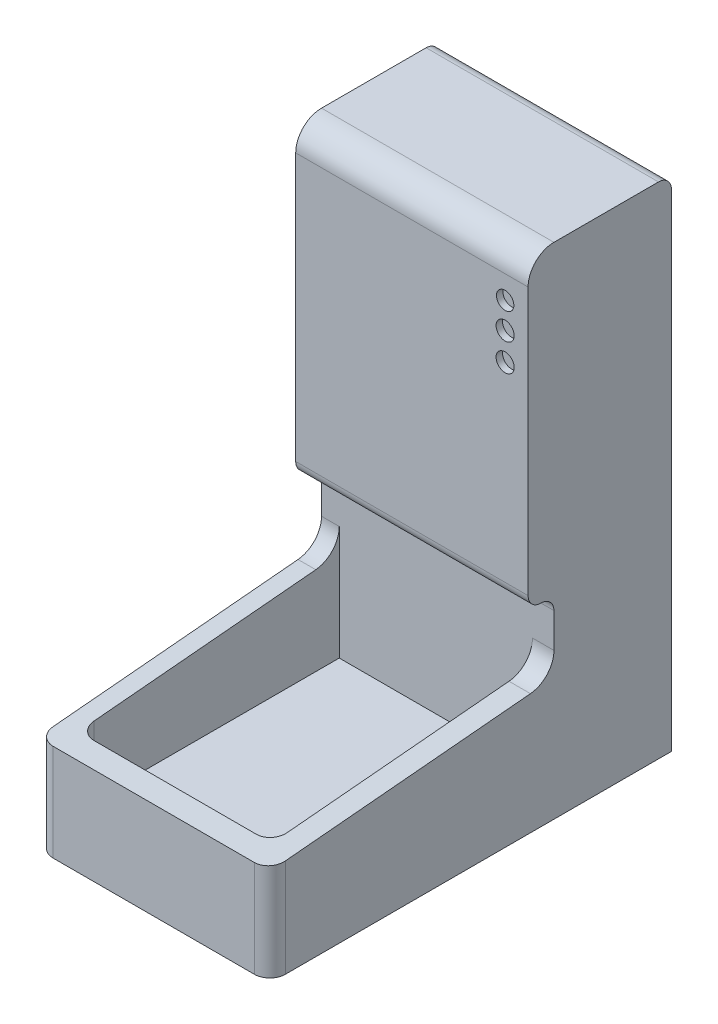
ISO-10303-21;
HEADER;
FILE_DESCRIPTION(('STEP AP214'),'2;1');
FILE_NAME('part.step','',(''),(''),'','','');
FILE_SCHEMA(('AUTOMOTIVE_DESIGN { 1 0 10303 214 1 1 1 1 }'));
ENDSEC;
DATA;
#1=APPLICATION_CONTEXT('core data for automotive mechanical design processes');
#2=APPLICATION_PROTOCOL_DEFINITION('international standard','automotive_design',2000,#1);
#3=PRODUCT_CONTEXT('',#1,'mechanical');
#4=PRODUCT('Part','Part','',(#3));
#5=PRODUCT_RELATED_PRODUCT_CATEGORY('part','',(#4));
#6=PRODUCT_DEFINITION_FORMATION('','',#4);
#7=PRODUCT_DEFINITION_CONTEXT('part definition',#1,'design');
#8=PRODUCT_DEFINITION('design','',#6,#7);
#9=PRODUCT_DEFINITION_SHAPE('','',#8);
#10=(LENGTH_UNIT() NAMED_UNIT(*) SI_UNIT(.MILLI.,.METRE.));
#11=(NAMED_UNIT(*) PLANE_ANGLE_UNIT() SI_UNIT($,.RADIAN.));
#12=(NAMED_UNIT(*) SI_UNIT($,.STERADIAN.) SOLID_ANGLE_UNIT());
#13=UNCERTAINTY_MEASURE_WITH_UNIT(LENGTH_MEASURE(1.E-05),#10,'distance_accuracy_value','');
#14=(GEOMETRIC_REPRESENTATION_CONTEXT(3) GLOBAL_UNCERTAINTY_ASSIGNED_CONTEXT((#13)) GLOBAL_UNIT_ASSIGNED_CONTEXT((#10,
#11,#12)) REPRESENTATION_CONTEXT('',''));
#15=CARTESIAN_POINT('',(0.,0.,0.));
#16=DIRECTION('',(0.,0.,1.));
#17=DIRECTION('',(1.,0.,0.));
#18=AXIS2_PLACEMENT_3D('',#15,#16,#17);
#19=CARTESIAN_POINT('',(2286.,-1104.9,901.7));
#20=DIRECTION('',(0.,0.,-1.));
#21=DIRECTION('',(0.,1.,0.));
#22=AXIS2_PLACEMENT_3D('',#19,#20,#21);
#23=PLANE('',#22);
#24=DIRECTION('',(0.,-1.,0.));
#25=VECTOR('',#24,1.);
#26=CARTESIAN_POINT('',(1863.97057831795,-2374.9,901.7));
#27=LINE('',#26,#25);
#28=CARTESIAN_POINT('',(1863.97057831795,-2037.98696393353,901.7));
#29=VERTEX_POINT('',#28);
#30=CARTESIAN_POINT('',(1863.97057831795,-4279.9,901.7));
#31=VERTEX_POINT('',#30);
#32=EDGE_CURVE('E174',#29,#31,#27,.T.);
#33=ORIENTED_EDGE('',*,*,#32,.F.);
#34=DIRECTION('',(1.,0.,0.));
#35=VECTOR('',#34,1.);
#36=CARTESIAN_POINT('',(2286.,-2037.98696393353,901.7));
#37=LINE('',#36,#35);
#38=CARTESIAN_POINT('',(2286.,-2037.98696393353,901.7));
#39=VERTEX_POINT('',#38);
#40=EDGE_CURVE('E346',#29,#39,#37,.T.);
#41=ORIENTED_EDGE('',*,*,#40,.T.);
#42=DIRECTION('',(0.,-1.,0.));
#43=VECTOR('',#42,1.);
#44=CARTESIAN_POINT('',(2286.,-1104.9,901.7));
#45=LINE('',#44,#43);
#46=CARTESIAN_POINT('',(2286.,-1358.9,901.7));
#47=VERTEX_POINT('',#46);
#48=EDGE_CURVE('E232',#47,#39,#45,.T.);
#49=ORIENTED_EDGE('',*,*,#48,.F.);
#50=DIRECTION('',(-1.,0.,0.));
#51=VECTOR('',#50,1.);
#52=CARTESIAN_POINT('',(-2286.,-1358.9,901.7));
#53=LINE('',#52,#51);
#54=CARTESIAN_POINT('',(-2286.,-1358.9,901.7));
#55=VERTEX_POINT('',#54);
#56=EDGE_CURVE('E292',#47,#55,#53,.T.);
#57=ORIENTED_EDGE('',*,*,#56,.T.);
#58=DIRECTION('',(0.,-1.,0.));
#59=VECTOR('',#58,1.);
#60=CARTESIAN_POINT('',(-2286.,-1104.9,901.7));
#61=LINE('',#60,#59);
#62=CARTESIAN_POINT('',(-2286.,-2037.98696393353,901.7));
#63=VERTEX_POINT('',#62);
#64=EDGE_CURVE('E246',#55,#63,#61,.T.);
#65=ORIENTED_EDGE('',*,*,#64,.T.);
#66=DIRECTION('',(1.,0.,0.));
#67=VECTOR('',#66,1.);
#68=CARTESIAN_POINT('',(2286.,-2037.98696393353,901.7));
#69=LINE('',#68,#67);
#70=CARTESIAN_POINT('',(-1937.25143072823,-2037.98696393353,901.7));
#71=VERTEX_POINT('',#70);
#72=EDGE_CURVE('E344',#63,#71,#69,.T.);
#73=ORIENTED_EDGE('',*,*,#72,.T.);
#74=DIRECTION('',(0.,-1.,0.));
#75=VECTOR('',#74,1.);
#76=CARTESIAN_POINT('',(-1937.25143072823,-2374.9,901.7));
#77=LINE('',#76,#75);
#78=CARTESIAN_POINT('',(-1937.25143072823,-4279.9,901.7));
#79=VERTEX_POINT('',#78);
#80=EDGE_CURVE('E187',#71,#79,#77,.T.);
#81=ORIENTED_EDGE('',*,*,#80,.T.);
#82=DIRECTION('',(1.,0.,0.));
#83=VECTOR('',#82,1.);
#84=CARTESIAN_POINT('',(-1937.25143072823,-4279.9,901.7));
#85=LINE('',#84,#83);
#86=EDGE_CURVE('E191',#79,#31,#85,.T.);
#87=ORIENTED_EDGE('',*,*,#86,.T.);
#88=EDGE_LOOP('',(#33,#41,#49,#57,#65,#73,#81,#87));
#89=FACE_BOUND('',#88,.T.);
#90=ADVANCED_FACE('F33',(#89),#23,.F.);
#91=CARTESIAN_POINT('',(-1937.25143072823,-2374.9,6031.00359694514));
#92=DIRECTION('',(-1.,0.,0.));
#93=DIRECTION('',(0.,0.,1.));
#94=AXIS2_PLACEMENT_3D('',#91,#92,#93);
#95=PLANE('',#94);
#96=ORIENTED_EDGE('',*,*,#80,.F.);
#97=CARTESIAN_POINT('',(-1937.25143072823,-2037.98696393353,1409.7));
#98=DIRECTION('',(-1.,0.,0.));
#99=DIRECTION('',(0.,0.,1.));
#100=AXIS2_PLACEMENT_3D('',#97,#98,#99);
#101=CIRCLE('',#100,508.);
#102=CARTESIAN_POINT('',(-1937.25143072823,-2543.90071281913,1363.7078410104));
#103=VERTEX_POINT('',#102);
#104=EDGE_CURVE('E41',#71,#103,#101,.T.);
#105=ORIENTED_EDGE('',*,*,#104,.T.);
#106=DIRECTION('',(0.,-0.0905357460425185,0.995893206467704));
#107=VECTOR('',#106,1.);
#108=CARTESIAN_POINT('',(-1937.25143072823,-3009.9,6489.7));
#109=LINE('',#108,#107);
#110=CARTESIAN_POINT('',(-1937.25143072823,-2940.49123608592,5726.20359694514));
#111=VERTEX_POINT('',#110);
#112=EDGE_CURVE('E304',#103,#111,#109,.T.);
#113=ORIENTED_EDGE('',*,*,#112,.T.);
#114=DIRECTION('',(0.,-1.,0.));
#115=VECTOR('',#114,1.);
#116=CARTESIAN_POINT('',(-1937.25143072823,-4279.9,5726.20359694514));
#117=LINE('',#116,#115);
#118=CARTESIAN_POINT('',(-1937.25143072823,-4279.9,5726.20359694514));
#119=VERTEX_POINT('',#118);
#120=EDGE_CURVE('E316',#111,#119,#117,.T.);
#121=ORIENTED_EDGE('',*,*,#120,.T.);
#122=DIRECTION('',(0.,0.,-1.));
#123=VECTOR('',#122,1.);
#124=CARTESIAN_POINT('',(-1937.25143072823,-4279.9,6031.00359694514));
#125=LINE('',#124,#123);
#126=EDGE_CURVE('E195',#119,#79,#125,.T.);
#127=ORIENTED_EDGE('',*,*,#126,.T.);
#128=EDGE_LOOP('',(#96,#105,#113,#121,#127));
#129=FACE_BOUND('',#128,.T.);
#130=ADVANCED_FACE('F428',(#129),#95,.F.);
#131=CARTESIAN_POINT('',(-1937.25143072823,-2374.9,6031.00359694514));
#132=DIRECTION('',(0.,0.,1.));
#133=DIRECTION('',(0.,-1.,0.));
#134=AXIS2_PLACEMENT_3D('',#131,#132,#133);
#135=PLANE('',#134);
#136=DIRECTION('',(1.,0.,0.));
#137=VECTOR('',#136,1.);
#138=CARTESIAN_POINT('',(-2286.,-2968.20032699501,6031.00359694514));
#139=LINE('',#138,#137);
#140=CARTESIAN_POINT('',(-1632.45143072823,-2968.20032699501,6031.00359694514));
#141=VERTEX_POINT('',#140);
#142=CARTESIAN_POINT('',(1559.17057831795,-2968.20032699501,6031.00359694514));
#143=VERTEX_POINT('',#142);
#144=EDGE_CURVE('E301',#141,#143,#139,.T.);
#145=ORIENTED_EDGE('',*,*,#144,.T.);
#146=DIRECTION('',(0.,-1.,0.));
#147=VECTOR('',#146,1.);
#148=CARTESIAN_POINT('',(1559.17057831795,-4279.9,6031.00359694514));
#149=LINE('',#148,#147);
#150=CARTESIAN_POINT('',(1559.17057831795,-4279.9,6031.00359694514));
#151=VERTEX_POINT('',#150);
#152=EDGE_CURVE('E308',#143,#151,#149,.T.);
#153=ORIENTED_EDGE('',*,*,#152,.T.);
#154=DIRECTION('',(-1.,0.,0.));
#155=VECTOR('',#154,1.);
#156=CARTESIAN_POINT('',(-1937.25143072823,-4279.9,6031.00359694514));
#157=LINE('',#156,#155);
#158=CARTESIAN_POINT('',(-1632.45143072823,-4279.9,6031.00359694514));
#159=VERTEX_POINT('',#158);
#160=EDGE_CURVE('E200',#151,#159,#157,.T.);
#161=ORIENTED_EDGE('',*,*,#160,.T.);
#162=DIRECTION('',(0.,-1.,0.));
#163=VECTOR('',#162,1.);
#164=CARTESIAN_POINT('',(-1632.45143072823,-2968.20032699501,6031.00359694514));
#165=LINE('',#164,#163);
#166=EDGE_CURVE('E306',#159,#141,#165,.F.);
#167=ORIENTED_EDGE('',*,*,#166,.T.);
#168=EDGE_LOOP('',(#145,#153,#161,#167));
#169=FACE_BOUND('',#168,.T.);
#170=ADVANCED_FACE('F433',(#169),#135,.F.);
#171=CARTESIAN_POINT('',(1863.97057831795,-2374.9,6031.00359694514));
#172=DIRECTION('',(1.,0.,0.));
#173=DIRECTION('',(0.,0.,-1.));
#174=AXIS2_PLACEMENT_3D('',#171,#172,#173);
#175=PLANE('',#174);
#176=DIRECTION('',(0.,0.,1.));
#177=VECTOR('',#176,1.);
#178=CARTESIAN_POINT('',(1863.97057831795,-4279.9,6031.00359694514));
#179=LINE('',#178,#177);
#180=CARTESIAN_POINT('',(1863.97057831795,-4279.9,5726.20359694514));
#181=VERTEX_POINT('',#180);
#182=EDGE_CURVE('E178',#31,#181,#179,.T.);
#183=ORIENTED_EDGE('',*,*,#182,.T.);
#184=DIRECTION('',(0.,-1.,0.));
#185=VECTOR('',#184,1.);
#186=CARTESIAN_POINT('',(1863.97057831795,-2968.20032699501,5726.20359694514));
#187=LINE('',#186,#185);
#188=CARTESIAN_POINT('',(1863.97057831795,-2940.49123608592,5726.20359694514));
#189=VERTEX_POINT('',#188);
#190=EDGE_CURVE('E314',#181,#189,#187,.F.);
#191=ORIENTED_EDGE('',*,*,#190,.T.);
#192=DIRECTION('',(0.,0.0905357460425185,-0.995893206467704));
#193=VECTOR('',#192,1.);
#194=CARTESIAN_POINT('',(1863.97057831795,-3009.9,6489.7));
#195=LINE('',#194,#193);
#196=CARTESIAN_POINT('',(1863.97057831795,-2543.90071281913,1363.7078410104));
#197=VERTEX_POINT('',#196);
#198=EDGE_CURVE('E299',#189,#197,#195,.T.);
#199=ORIENTED_EDGE('',*,*,#198,.T.);
#200=CARTESIAN_POINT('',(1863.97057831795,-2037.98696393353,1409.7));
#201=DIRECTION('',(1.,0.,0.));
#202=DIRECTION('',(0.,0.,-1.));
#203=AXIS2_PLACEMENT_3D('',#200,#201,#202);
#204=CIRCLE('',#203,508.);
#205=EDGE_CURVE('E182',#197,#29,#204,.T.);
#206=ORIENTED_EDGE('',*,*,#205,.T.);
#207=ORIENTED_EDGE('',*,*,#32,.T.);
#208=EDGE_LOOP('',(#183,#191,#199,#206,#207));
#209=FACE_BOUND('',#208,.T.);
#210=ADVANCED_FACE('F176',(#209),#175,.F.);
#211=CARTESIAN_POINT('',(2286.,-1104.9,1409.7));
#212=DIRECTION('',(0.,0.,-1.));
#213=DIRECTION('',(-1.,0.,0.));
#214=AXIS2_PLACEMENT_3D('',#211,#212,#213);
#215=PLANE('',#214);
#216=CARTESIAN_POINT('',(1834.34503113877,3953.74526364137,1409.7));
#217=DIRECTION('',(0.,0.,1.));
#218=DIRECTION('',(1.,0.,0.));
#219=AXIS2_PLACEMENT_3D('',#216,#217,#218);
#220=CIRCLE('',#219,171.4501557811);
#221=CARTESIAN_POINT('',(2005.79518691987,3953.74526364137,1409.7));
#222=VERTEX_POINT('',#221);
#223=EDGE_CURVE('E215',#222,#222,#220,.T.);
#224=ORIENTED_EDGE('',*,*,#223,.F.);
#225=EDGE_LOOP('',(#224));
#226=FACE_BOUND('',#225,.T.);
#227=CARTESIAN_POINT('',(1834.34503113877,3439.39479629807,1409.7));
#228=DIRECTION('',(0.,0.,1.));
#229=DIRECTION('',(1.,0.,0.));
#230=AXIS2_PLACEMENT_3D('',#227,#228,#229);
#231=CIRCLE('',#230,178.04439254191);
#232=CARTESIAN_POINT('',(2012.38942368068,3439.39479629807,1409.7));
#233=VERTEX_POINT('',#232);
#234=EDGE_CURVE('E221',#233,#233,#231,.T.);
#235=ORIENTED_EDGE('',*,*,#234,.F.);
#236=EDGE_LOOP('',(#235));
#237=FACE_BOUND('',#236,.T.);
#238=CARTESIAN_POINT('',(1834.34503113877,2898.66738191153,1409.7));
#239=DIRECTION('',(0.,0.,1.));
#240=DIRECTION('',(1.,0.,0.));
#241=AXIS2_PLACEMENT_3D('',#238,#239,#240);
#242=CIRCLE('',#241,178.044392541911);
#243=CARTESIAN_POINT('',(2012.38942368069,2898.66738191153,1409.7));
#244=VERTEX_POINT('',#243);
#245=EDGE_CURVE('E209',#244,#244,#242,.T.);
#246=ORIENTED_EDGE('',*,*,#245,.F.);
#247=EDGE_LOOP('',(#246));
#248=FACE_BOUND('',#247,.T.);
#249=DIRECTION('',(0.,-1.,0.));
#250=VECTOR('',#249,1.);
#251=CARTESIAN_POINT('',(-2286.,-1104.9,1409.7));
#252=LINE('',#251,#250);
#253=CARTESIAN_POINT('',(-2286.,4406.9,1409.7));
#254=VERTEX_POINT('',#253);
#255=CARTESIAN_POINT('',(-2286.,-850.900000000002,1409.7));
#256=VERTEX_POINT('',#255);
#257=EDGE_CURVE('E214',#254,#256,#252,.T.);
#258=ORIENTED_EDGE('',*,*,#257,.T.);
#259=DIRECTION('',(-1.,0.,0.));
#260=VECTOR('',#259,1.);
#261=CARTESIAN_POINT('',(2286.,-850.900000000002,1409.7));
#262=LINE('',#261,#260);
#263=CARTESIAN_POINT('',(2286.,-850.900000000002,1409.7));
#264=VERTEX_POINT('',#263);
#265=EDGE_CURVE('E290',#256,#264,#262,.F.);
#266=ORIENTED_EDGE('',*,*,#265,.T.);
#267=DIRECTION('',(0.,-1.,0.));
#268=VECTOR('',#267,1.);
#269=CARTESIAN_POINT('',(2286.,-1104.9,1409.7));
#270=LINE('',#269,#268);
#271=CARTESIAN_POINT('',(2286.,4406.9,1409.7));
#272=VERTEX_POINT('',#271);
#273=EDGE_CURVE('E229',#272,#264,#270,.T.);
#274=ORIENTED_EDGE('',*,*,#273,.F.);
#275=DIRECTION('',(-1.,0.,0.));
#276=VECTOR('',#275,1.);
#277=CARTESIAN_POINT('',(2286.,4406.9,1409.7));
#278=LINE('',#277,#276);
#279=EDGE_CURVE('E263',#272,#254,#278,.T.);
#280=ORIENTED_EDGE('',*,*,#279,.T.);
#281=EDGE_LOOP('',(#258,#266,#274,#280));
#282=FACE_BOUND('',#281,.T.);
#283=ADVANCED_FACE('F382',(#226,#237,#248,#282),#215,.F.);
#284=CARTESIAN_POINT('',(2286.,-4914.9,6489.7));
#285=DIRECTION('',(0.,0.,-1.));
#286=DIRECTION('',(-1.,0.,0.));
#287=AXIS2_PLACEMENT_3D('',#284,#285,#286);
#288=PLANE('',#287);
#289=DIRECTION('',(-1.,0.,0.));
#290=VECTOR('',#289,1.);
#291=CARTESIAN_POINT('',(2286.,-4914.9,6489.7));
#292=LINE('',#291,#290);
#293=CARTESIAN_POINT('',(1981.2,-4914.9,6489.7));
#294=VERTEX_POINT('',#293);
#295=CARTESIAN_POINT('',(-1981.2,-4914.9,6489.7));
#296=VERTEX_POINT('',#295);
#297=EDGE_CURVE('E257',#294,#296,#292,.T.);
#298=ORIENTED_EDGE('',*,*,#297,.F.);
#299=DIRECTION('',(0.,-1.,0.));
#300=VECTOR('',#299,1.);
#301=CARTESIAN_POINT('',(1981.2,-3009.9,6489.7));
#302=LINE('',#301,#300);
#303=CARTESIAN_POINT('',(1981.2,-3009.9,6489.7));
#304=VERTEX_POINT('',#303);
#305=EDGE_CURVE('E329',#294,#304,#302,.F.);
#306=ORIENTED_EDGE('',*,*,#305,.T.);
#307=DIRECTION('',(-1.,0.,0.));
#308=VECTOR('',#307,1.);
#309=CARTESIAN_POINT('',(2286.,-3009.9,6489.7));
#310=LINE('',#309,#308);
#311=CARTESIAN_POINT('',(-1981.2,-3009.9,6489.7));
#312=VERTEX_POINT('',#311);
#313=EDGE_CURVE('E260',#304,#312,#310,.T.);
#314=ORIENTED_EDGE('',*,*,#313,.T.);
#315=DIRECTION('',(0.,-1.,0.));
#316=VECTOR('',#315,1.);
#317=CARTESIAN_POINT('',(-1981.2,-4914.9,6489.7));
#318=LINE('',#317,#316);
#319=EDGE_CURVE('E326',#312,#296,#318,.T.);
#320=ORIENTED_EDGE('',*,*,#319,.T.);
#321=EDGE_LOOP('',(#298,#306,#314,#320));
#322=FACE_BOUND('',#321,.T.);
#323=ADVANCED_FACE('F412',(#322),#288,.F.);
#324=CARTESIAN_POINT('',(2286.,-4914.9,-1409.7));
#325=DIRECTION('',(0.,1.,0.));
#326=DIRECTION('',(0.,0.,1.));
#327=AXIS2_PLACEMENT_3D('',#324,#325,#326);
#328=PLANE('',#327);
#329=DIRECTION('',(0.,0.,-1.));
#330=VECTOR('',#329,1.);
#331=CARTESIAN_POINT('',(2286.,-4914.9,1409.7));
#332=LINE('',#331,#330);
#333=CARTESIAN_POINT('',(2286.,-4914.9,6184.9));
#334=VERTEX_POINT('',#333);
#335=CARTESIAN_POINT('',(2286.,-4914.9,-1409.7));
#336=VERTEX_POINT('',#335);
#337=EDGE_CURVE('E236',#334,#336,#332,.T.);
#338=ORIENTED_EDGE('',*,*,#337,.F.);
#339=CARTESIAN_POINT('',(1981.2,-4914.9,6184.9));
#340=DIRECTION('',(0.,1.,0.));
#341=DIRECTION('',(0.,0.,1.));
#342=AXIS2_PLACEMENT_3D('',#339,#340,#341);
#343=CIRCLE('',#342,304.8);
#344=EDGE_CURVE('E324',#334,#294,#343,.F.);
#345=ORIENTED_EDGE('',*,*,#344,.T.);
#346=ORIENTED_EDGE('',*,*,#297,.T.);
#347=CARTESIAN_POINT('',(-1981.2,-4914.9,6184.9));
#348=DIRECTION('',(0.,1.,0.));
#349=DIRECTION('',(0.,0.,1.));
#350=AXIS2_PLACEMENT_3D('',#347,#348,#349);
#351=CIRCLE('',#350,304.8);
#352=CARTESIAN_POINT('',(-2286.,-4914.9,6184.9));
#353=VERTEX_POINT('',#352);
#354=EDGE_CURVE('E322',#296,#353,#351,.F.);
#355=ORIENTED_EDGE('',*,*,#354,.T.);
#356=DIRECTION('',(0.,0.,-1.));
#357=VECTOR('',#356,1.);
#358=CARTESIAN_POINT('',(-2286.,-4914.9,-1409.7));
#359=LINE('',#358,#357);
#360=CARTESIAN_POINT('',(-2286.,-4914.9,-1409.7));
#361=VERTEX_POINT('',#360);
#362=EDGE_CURVE('E249',#353,#361,#359,.T.);
#363=ORIENTED_EDGE('',*,*,#362,.T.);
#364=DIRECTION('',(-1.,0.,0.));
#365=VECTOR('',#364,1.);
#366=CARTESIAN_POINT('',(2286.,-4914.9,-1409.7));
#367=LINE('',#366,#365);
#368=EDGE_CURVE('E243',#336,#361,#367,.T.);
#369=ORIENTED_EDGE('',*,*,#368,.F.);
#370=EDGE_LOOP('',(#338,#345,#346,#355,#363,#369));
#371=FACE_BOUND('',#370,.T.);
#372=ADVANCED_FACE('F404',(#371),#328,.F.);
#373=CARTESIAN_POINT('',(2286.,-4914.9,-1409.7));
#374=DIRECTION('',(0.,0.,1.));
#375=DIRECTION('',(1.,0.,0.));
#376=AXIS2_PLACEMENT_3D('',#373,#374,#375);
#377=PLANE('',#376);
#378=DIRECTION('',(0.,1.,0.));
#379=VECTOR('',#378,1.);
#380=CARTESIAN_POINT('',(-2286.,-4914.9,-1409.7));
#381=LINE('',#380,#379);
#382=CARTESIAN_POINT('',(-2286.,4660.9,-1409.7));
#383=VERTEX_POINT('',#382);
#384=EDGE_CURVE('E251',#361,#383,#381,.T.);
#385=ORIENTED_EDGE('',*,*,#384,.T.);
#386=DIRECTION('',(-1.,0.,0.));
#387=VECTOR('',#386,1.);
#388=CARTESIAN_POINT('',(2286.,4660.9,-1409.7));
#389=LINE('',#388,#387);
#390=CARTESIAN_POINT('',(2286.,4660.9,-1409.7));
#391=VERTEX_POINT('',#390);
#392=EDGE_CURVE('E281',#383,#391,#389,.F.);
#393=ORIENTED_EDGE('',*,*,#392,.T.);
#394=DIRECTION('',(0.,1.,0.));
#395=VECTOR('',#394,1.);
#396=CARTESIAN_POINT('',(2286.,-4914.9,-1409.7));
#397=LINE('',#396,#395);
#398=EDGE_CURVE('E238',#336,#391,#397,.T.);
#399=ORIENTED_EDGE('',*,*,#398,.F.);
#400=ORIENTED_EDGE('',*,*,#368,.T.);
#401=EDGE_LOOP('',(#385,#393,#399,#400));
#402=FACE_BOUND('',#401,.T.);
#403=ADVANCED_FACE('F400',(#402),#377,.F.);
#404=CARTESIAN_POINT('',(2286.,4914.9,-1409.7));
#405=DIRECTION('',(0.,-1.,0.));
#406=DIRECTION('',(0.,0.,-1.));
#407=AXIS2_PLACEMENT_3D('',#404,#405,#406);
#408=PLANE('',#407);
#409=DIRECTION('',(0.,0.,1.));
#410=VECTOR('',#409,1.);
#411=CARTESIAN_POINT('',(2286.,4914.9,-1409.7));
#412=LINE('',#411,#410);
#413=CARTESIAN_POINT('',(2286.,4914.9,-1155.7));
#414=VERTEX_POINT('',#413);
#415=CARTESIAN_POINT('',(2286.,4914.9,901.699999999999));
#416=VERTEX_POINT('',#415);
#417=EDGE_CURVE('E241',#414,#416,#412,.T.);
#418=ORIENTED_EDGE('',*,*,#417,.F.);
#419=DIRECTION('',(-1.,0.,0.));
#420=VECTOR('',#419,1.);
#421=CARTESIAN_POINT('',(2286.,4914.9,-1155.7));
#422=LINE('',#421,#420);
#423=CARTESIAN_POINT('',(-2286.,4914.9,-1155.7));
#424=VERTEX_POINT('',#423);
#425=EDGE_CURVE('E274',#414,#424,#422,.T.);
#426=ORIENTED_EDGE('',*,*,#425,.T.);
#427=DIRECTION('',(0.,0.,1.));
#428=VECTOR('',#427,1.);
#429=CARTESIAN_POINT('',(-2286.,4914.9,-1409.7));
#430=LINE('',#429,#428);
#431=CARTESIAN_POINT('',(-2286.,4914.9,901.699999999999));
#432=VERTEX_POINT('',#431);
#433=EDGE_CURVE('E233',#424,#432,#430,.T.);
#434=ORIENTED_EDGE('',*,*,#433,.T.);
#435=DIRECTION('',(-1.,0.,0.));
#436=VECTOR('',#435,1.);
#437=CARTESIAN_POINT('',(2286.,4914.9,901.7));
#438=LINE('',#437,#436);
#439=EDGE_CURVE('E269',#432,#416,#438,.F.);
#440=ORIENTED_EDGE('',*,*,#439,.T.);
#441=EDGE_LOOP('',(#418,#426,#434,#440));
#442=FACE_BOUND('',#441,.T.);
#443=ADVANCED_FACE('F392',(#442),#408,.F.);
#444=CARTESIAN_POINT('',(2286.,0.,0.));
#445=DIRECTION('',(1.,0.,0.));
#446=DIRECTION('',(0.,0.,-1.));
#447=AXIS2_PLACEMENT_3D('',#444,#445,#446);
#448=PLANE('',#447);
#449=ORIENTED_EDGE('',*,*,#48,.T.);
#450=CARTESIAN_POINT('',(2286.,-2037.98696393353,1409.7));
#451=DIRECTION('',(1.,0.,0.));
#452=DIRECTION('',(0.,0.,-1.));
#453=AXIS2_PLACEMENT_3D('',#450,#451,#452);
#454=CIRCLE('',#453,508.);
#455=CARTESIAN_POINT('',(2286.,-2543.90071281913,1363.7078410104));
#456=VERTEX_POINT('',#455);
#457=EDGE_CURVE('E351',#39,#456,#454,.F.);
#458=ORIENTED_EDGE('',*,*,#457,.T.);
#459=DIRECTION('',(0.,-0.0905357460425185,0.995893206467704));
#460=VECTOR('',#459,1.);
#461=CARTESIAN_POINT('',(2286.,-3009.9,6489.7));
#462=LINE('',#461,#460);
#463=CARTESIAN_POINT('',(2286.,-2982.19090909091,6184.9));
#464=VERTEX_POINT('',#463);
#465=EDGE_CURVE('E186',#456,#464,#462,.T.);
#466=ORIENTED_EDGE('',*,*,#465,.T.);
#467=DIRECTION('',(0.,-1.,0.));
#468=VECTOR('',#467,1.);
#469=CARTESIAN_POINT('',(2286.,-4914.9,6184.9));
#470=LINE('',#469,#468);
#471=EDGE_CURVE('E319',#464,#334,#470,.T.);
#472=ORIENTED_EDGE('',*,*,#471,.T.);
#473=ORIENTED_EDGE('',*,*,#337,.T.);
#474=ORIENTED_EDGE('',*,*,#398,.T.);
#475=CARTESIAN_POINT('',(2286.,4660.9,-1155.7));
#476=DIRECTION('',(1.,0.,0.));
#477=DIRECTION('',(0.,0.,-1.));
#478=AXIS2_PLACEMENT_3D('',#475,#476,#477);
#479=CIRCLE('',#478,254.);
#480=EDGE_CURVE('E285',#391,#414,#479,.T.);
#481=ORIENTED_EDGE('',*,*,#480,.T.);
#482=ORIENTED_EDGE('',*,*,#417,.T.);
#483=CARTESIAN_POINT('',(2286.,4406.9,901.7));
#484=DIRECTION('',(1.,0.,0.));
#485=DIRECTION('',(0.,0.,-1.));
#486=AXIS2_PLACEMENT_3D('',#483,#484,#485);
#487=CIRCLE('',#486,508.);
#488=EDGE_CURVE('E272',#416,#272,#487,.T.);
#489=ORIENTED_EDGE('',*,*,#488,.T.);
#490=ORIENTED_EDGE('',*,*,#273,.T.);
#491=CARTESIAN_POINT('',(2286.,-850.900000000002,1155.7));
#492=DIRECTION('',(1.,0.,0.));
#493=DIRECTION('',(0.,0.,-1.));
#494=AXIS2_PLACEMENT_3D('',#491,#492,#493);
#495=CIRCLE('',#494,254.);
#496=CARTESIAN_POINT('',(2286.,-1104.9,1155.7));
#497=VERTEX_POINT('',#496);
#498=EDGE_CURVE('E283',#264,#497,#495,.T.);
#499=ORIENTED_EDGE('',*,*,#498,.T.);
#500=CARTESIAN_POINT('',(2286.,-1358.9,1155.7));
#501=DIRECTION('',(1.,0.,0.));
#502=DIRECTION('',(0.,0.,-1.));
#503=AXIS2_PLACEMENT_3D('',#500,#501,#502);
#504=CIRCLE('',#503,254.);
#505=EDGE_CURVE('E297',#497,#47,#504,.F.);
#506=ORIENTED_EDGE('',*,*,#505,.T.);
#507=EDGE_LOOP('',(#449,#458,#466,#472,#473,#474,#481,#482,#489,#490,#499,#506));
#508=FACE_BOUND('',#507,.T.);
#509=ADVANCED_FACE('F355',(#508),#448,.T.);
#510=CARTESIAN_POINT('',(-2286.,0.,0.));
#511=DIRECTION('',(1.,0.,0.));
#512=DIRECTION('',(0.,0.,-1.));
#513=AXIS2_PLACEMENT_3D('',#510,#511,#512);
#514=PLANE('',#513);
#515=ORIENTED_EDGE('',*,*,#362,.F.);
#516=DIRECTION('',(0.,-1.,0.));
#517=VECTOR('',#516,1.);
#518=CARTESIAN_POINT('',(-2286.,0.,6184.9));
#519=LINE('',#518,#517);
#520=CARTESIAN_POINT('',(-2286.,-2982.19090909091,6184.9));
#521=VERTEX_POINT('',#520);
#522=EDGE_CURVE('E336',#353,#521,#519,.F.);
#523=ORIENTED_EDGE('',*,*,#522,.T.);
#524=DIRECTION('',(0.,-0.0905357460425185,0.995893206467704));
#525=VECTOR('',#524,1.);
#526=CARTESIAN_POINT('',(-2286.,-3009.9,6489.7));
#527=LINE('',#526,#525);
#528=CARTESIAN_POINT('',(-2286.,-2543.90071281913,1363.7078410104));
#529=VERTEX_POINT('',#528);
#530=EDGE_CURVE('E207',#529,#521,#527,.T.);
#531=ORIENTED_EDGE('',*,*,#530,.F.);
#532=CARTESIAN_POINT('',(-2286.,-2037.98696393353,1409.7));
#533=DIRECTION('',(1.,0.,0.));
#534=DIRECTION('',(0.,0.,-1.));
#535=AXIS2_PLACEMENT_3D('',#532,#533,#534);
#536=CIRCLE('',#535,508.);
#537=EDGE_CURVE('E11',#529,#63,#536,.T.);
#538=ORIENTED_EDGE('',*,*,#537,.T.);
#539=ORIENTED_EDGE('',*,*,#64,.F.);
#540=CARTESIAN_POINT('',(-2286.,-1358.9,1155.7));
#541=DIRECTION('',(1.,0.,0.));
#542=DIRECTION('',(0.,0.,-1.));
#543=AXIS2_PLACEMENT_3D('',#540,#541,#542);
#544=CIRCLE('',#543,254.);
#545=CARTESIAN_POINT('',(-2286.,-1104.9,1155.7));
#546=VERTEX_POINT('',#545);
#547=EDGE_CURVE('E295',#55,#546,#544,.T.);
#548=ORIENTED_EDGE('',*,*,#547,.T.);
#549=CARTESIAN_POINT('',(-2286.,-850.900000000002,1155.7));
#550=DIRECTION('',(1.,0.,0.));
#551=DIRECTION('',(0.,0.,-1.));
#552=AXIS2_PLACEMENT_3D('',#549,#550,#551);
#553=CIRCLE('',#552,254.);
#554=EDGE_CURVE('E277',#546,#256,#553,.F.);
#555=ORIENTED_EDGE('',*,*,#554,.T.);
#556=ORIENTED_EDGE('',*,*,#257,.F.);
#557=CARTESIAN_POINT('',(-2286.,4406.9,901.7));
#558=DIRECTION('',(1.,0.,0.));
#559=DIRECTION('',(0.,0.,-1.));
#560=AXIS2_PLACEMENT_3D('',#557,#558,#559);
#561=CIRCLE('',#560,508.);
#562=EDGE_CURVE('E266',#254,#432,#561,.F.);
#563=ORIENTED_EDGE('',*,*,#562,.T.);
#564=ORIENTED_EDGE('',*,*,#433,.F.);
#565=CARTESIAN_POINT('',(-2286.,4660.9,-1155.7));
#566=DIRECTION('',(1.,0.,0.));
#567=DIRECTION('',(0.,0.,-1.));
#568=AXIS2_PLACEMENT_3D('',#565,#566,#567);
#569=CIRCLE('',#568,254.);
#570=EDGE_CURVE('E279',#424,#383,#569,.F.);
#571=ORIENTED_EDGE('',*,*,#570,.T.);
#572=ORIENTED_EDGE('',*,*,#384,.F.);
#573=EDGE_LOOP('',(#515,#523,#531,#538,#539,#548,#555,#556,#563,#564,#571,#572));
#574=FACE_BOUND('',#573,.T.);
#575=ADVANCED_FACE('F374',(#574),#514,.F.);
#576=CARTESIAN_POINT('',(2286.,4406.9,901.7));
#577=DIRECTION('',(-1.,0.,0.));
#578=DIRECTION('',(0.,0.,1.));
#579=AXIS2_PLACEMENT_3D('',#576,#577,#578);
#580=CYLINDRICAL_SURFACE('',#579,508.);
#581=ORIENTED_EDGE('',*,*,#488,.F.);
#582=ORIENTED_EDGE('',*,*,#439,.F.);
#583=ORIENTED_EDGE('',*,*,#562,.F.);
#584=ORIENTED_EDGE('',*,*,#279,.F.);
#585=EDGE_LOOP('',(#581,#582,#583,#584));
#586=FACE_BOUND('',#585,.T.);
#587=ADVANCED_FACE('F388',(#586),#580,.T.);
#588=CARTESIAN_POINT('',(2286.,4660.9,-1155.7));
#589=DIRECTION('',(-1.,0.,0.));
#590=DIRECTION('',(0.,0.,1.));
#591=AXIS2_PLACEMENT_3D('',#588,#589,#590);
#592=CYLINDRICAL_SURFACE('',#591,254.);
#593=ORIENTED_EDGE('',*,*,#480,.F.);
#594=ORIENTED_EDGE('',*,*,#392,.F.);
#595=ORIENTED_EDGE('',*,*,#570,.F.);
#596=ORIENTED_EDGE('',*,*,#425,.F.);
#597=EDGE_LOOP('',(#593,#594,#595,#596));
#598=FACE_BOUND('',#597,.T.);
#599=ADVANCED_FACE('F396',(#598),#592,.T.);
#600=CARTESIAN_POINT('',(2286.,-850.900000000002,1155.7));
#601=DIRECTION('',(-1.,0.,0.));
#602=DIRECTION('',(0.,0.,1.));
#603=AXIS2_PLACEMENT_3D('',#600,#601,#602);
#604=CYLINDRICAL_SURFACE('',#603,254.);
#605=ORIENTED_EDGE('',*,*,#498,.F.);
#606=ORIENTED_EDGE('',*,*,#265,.F.);
#607=ORIENTED_EDGE('',*,*,#554,.F.);
#608=DIRECTION('',(-1.,0.,0.));
#609=VECTOR('',#608,1.);
#610=CARTESIAN_POINT('',(2286.,-1104.9,1155.7));
#611=LINE('',#610,#609);
#612=EDGE_CURVE('E287',#497,#546,#611,.T.);
#613=ORIENTED_EDGE('',*,*,#612,.F.);
#614=EDGE_LOOP('',(#605,#606,#607,#613));
#615=FACE_BOUND('',#614,.T.);
#616=ADVANCED_FACE('F379',(#615),#604,.T.);
#617=CARTESIAN_POINT('',(2286.,-1358.9,1155.7));
#618=DIRECTION('',(1.,0.,0.));
#619=DIRECTION('',(0.,0.,-1.));
#620=AXIS2_PLACEMENT_3D('',#617,#618,#619);
#621=CYLINDRICAL_SURFACE('',#620,254.);
#622=ORIENTED_EDGE('',*,*,#505,.F.);
#623=ORIENTED_EDGE('',*,*,#612,.T.);
#624=ORIENTED_EDGE('',*,*,#547,.F.);
#625=ORIENTED_EDGE('',*,*,#56,.F.);
#626=EDGE_LOOP('',(#622,#623,#624,#625));
#627=FACE_BOUND('',#626,.T.);
#628=ADVANCED_FACE('F369',(#627),#621,.F.);
#629=CARTESIAN_POINT('',(1834.34503113877,2898.66738191153,1282.7));
#630=DIRECTION('',(0.,0.,1.));
#631=DIRECTION('',(1.,0.,0.));
#632=AXIS2_PLACEMENT_3D('',#629,#630,#631);
#633=CYLINDRICAL_SURFACE('',#632,178.044392541911);
#634=CARTESIAN_POINT('',(1834.34503113877,2898.66738191153,1282.7));
#635=DIRECTION('',(0.,0.,1.));
#636=DIRECTION('',(1.,0.,0.));
#637=AXIS2_PLACEMENT_3D('',#634,#635,#636);
#638=CIRCLE('',#637,178.044392541911);
#639=CARTESIAN_POINT('',(2012.38942368069,2898.66738191153,1282.7));
#640=VERTEX_POINT('',#639);
#641=EDGE_CURVE('E224',#640,#640,#638,.T.);
#642=ORIENTED_EDGE('',*,*,#641,.F.);
#643=EDGE_LOOP('',(#642));
#644=FACE_BOUND('',#643,.T.);
#645=ORIENTED_EDGE('',*,*,#245,.T.);
#646=EDGE_LOOP('',(#645));
#647=FACE_BOUND('',#646,.T.);
#648=ADVANCED_FACE('F449',(#644,#647),#633,.F.);
#649=CARTESIAN_POINT('',(1834.34503113877,2898.66738191153,1282.7));
#650=DIRECTION('',(0.,0.,1.));
#651=DIRECTION('',(1.,0.,0.));
#652=AXIS2_PLACEMENT_3D('',#649,#650,#651);
#653=PLANE('',#652);
#654=ORIENTED_EDGE('',*,*,#641,.T.);
#655=EDGE_LOOP('',(#654));
#656=FACE_BOUND('',#655,.T.);
#657=ADVANCED_FACE('F608',(#656),#653,.T.);
#658=CARTESIAN_POINT('',(1834.34503113877,3439.39479629807,1282.7));
#659=DIRECTION('',(0.,0.,1.));
#660=DIRECTION('',(1.,0.,0.));
#661=AXIS2_PLACEMENT_3D('',#658,#659,#660);
#662=CYLINDRICAL_SURFACE('',#661,178.04439254191);
#663=CARTESIAN_POINT('',(1834.34503113877,3439.39479629807,1282.7));
#664=DIRECTION('',(0.,0.,1.));
#665=DIRECTION('',(1.,0.,0.));
#666=AXIS2_PLACEMENT_3D('',#663,#664,#665);
#667=CIRCLE('',#666,178.04439254191);
#668=CARTESIAN_POINT('',(2012.38942368068,3439.39479629807,1282.7));
#669=VERTEX_POINT('',#668);
#670=EDGE_CURVE('E218',#669,#669,#667,.T.);
#671=ORIENTED_EDGE('',*,*,#670,.F.);
#672=EDGE_LOOP('',(#671));
#673=FACE_BOUND('',#672,.T.);
#674=ORIENTED_EDGE('',*,*,#234,.T.);
#675=EDGE_LOOP('',(#674));
#676=FACE_BOUND('',#675,.T.);
#677=ADVANCED_FACE('F598',(#673,#676),#662,.F.);
#678=CARTESIAN_POINT('',(1834.34503113877,3439.39479629807,1282.7));
#679=DIRECTION('',(0.,0.,1.));
#680=DIRECTION('',(1.,0.,0.));
#681=AXIS2_PLACEMENT_3D('',#678,#679,#680);
#682=PLANE('',#681);
#683=ORIENTED_EDGE('',*,*,#670,.T.);
#684=EDGE_LOOP('',(#683));
#685=FACE_BOUND('',#684,.T.);
#686=ADVANCED_FACE('F588',(#685),#682,.T.);
#687=CARTESIAN_POINT('',(1834.34503113877,3953.74526364137,1282.7));
#688=DIRECTION('',(0.,0.,1.));
#689=DIRECTION('',(1.,0.,0.));
#690=AXIS2_PLACEMENT_3D('',#687,#688,#689);
#691=CYLINDRICAL_SURFACE('',#690,171.4501557811);
#692=CARTESIAN_POINT('',(1834.34503113877,3953.74526364137,1282.7));
#693=DIRECTION('',(0.,0.,1.));
#694=DIRECTION('',(1.,0.,0.));
#695=AXIS2_PLACEMENT_3D('',#692,#693,#694);
#696=CIRCLE('',#695,171.4501557811);
#697=CARTESIAN_POINT('',(2005.79518691987,3953.74526364137,1282.7));
#698=VERTEX_POINT('',#697);
#699=EDGE_CURVE('E211',#698,#698,#696,.T.);
#700=ORIENTED_EDGE('',*,*,#699,.F.);
#701=EDGE_LOOP('',(#700));
#702=FACE_BOUND('',#701,.T.);
#703=ORIENTED_EDGE('',*,*,#223,.T.);
#704=EDGE_LOOP('',(#703));
#705=FACE_BOUND('',#704,.T.);
#706=ADVANCED_FACE('F580',(#702,#705),#691,.F.);
#707=CARTESIAN_POINT('',(1834.34503113877,3953.74526364137,1282.7));
#708=DIRECTION('',(0.,0.,1.));
#709=DIRECTION('',(1.,0.,0.));
#710=AXIS2_PLACEMENT_3D('',#707,#708,#709);
#711=PLANE('',#710);
#712=ORIENTED_EDGE('',*,*,#699,.T.);
#713=EDGE_LOOP('',(#712));
#714=FACE_BOUND('',#713,.T.);
#715=ADVANCED_FACE('F529',(#714),#711,.T.);
#716=CARTESIAN_POINT('',(-2286.,-3009.9,6489.7));
#717=DIRECTION('',(0.,0.995893206467704,0.0905357460425185));
#718=DIRECTION('',(0.,-0.0905357460425185,0.995893206467704));
#719=AXIS2_PLACEMENT_3D('',#716,#717,#718);
#720=PLANE('',#719);
#721=ORIENTED_EDGE('',*,*,#465,.F.);
#722=DIRECTION('',(1.,0.,0.));
#723=VECTOR('',#722,1.);
#724=CARTESIAN_POINT('',(-2286.,-2543.90071281913,1363.7078410104));
#725=LINE('',#724,#723);
#726=EDGE_CURVE('E349',#456,#197,#725,.F.);
#727=ORIENTED_EDGE('',*,*,#726,.T.);
#728=ORIENTED_EDGE('',*,*,#198,.F.);
#729=CARTESIAN_POINT('',(1559.17057831795,-2940.49123608592,5726.20359694514));
#730=DIRECTION('',(0.,0.995893206467704,0.0905357460425185));
#731=DIRECTION('',(0.,0.0905357460425185,-0.995893206467704));
#732=AXIS2_PLACEMENT_3D('',#729,#730,#731);
#733=ELLIPSE('',#732,306.056912548971,304.8);
#734=EDGE_CURVE('E339',#189,#143,#733,.F.);
#735=ORIENTED_EDGE('',*,*,#734,.T.);
#736=ORIENTED_EDGE('',*,*,#144,.F.);
#737=CARTESIAN_POINT('',(-1632.45143072823,-2940.49123608592,5726.20359694514));
#738=DIRECTION('',(0.,0.995893206467704,0.0905357460425185));
#739=DIRECTION('',(0.,0.0905357460425185,-0.995893206467704));
#740=AXIS2_PLACEMENT_3D('',#737,#738,#739);
#741=ELLIPSE('',#740,306.056912548971,304.8);
#742=EDGE_CURVE('E341',#141,#111,#741,.F.);
#743=ORIENTED_EDGE('',*,*,#742,.T.);
#744=ORIENTED_EDGE('',*,*,#112,.F.);
#745=DIRECTION('',(1.,0.,0.));
#746=VECTOR('',#745,1.);
#747=CARTESIAN_POINT('',(-2286.,-2543.90071281913,1363.7078410104));
#748=LINE('',#747,#746);
#749=EDGE_CURVE('E48',#103,#529,#748,.F.);
#750=ORIENTED_EDGE('',*,*,#749,.T.);
#751=ORIENTED_EDGE('',*,*,#530,.T.);
#752=CARTESIAN_POINT('',(-1981.2,-2982.19090909091,6184.9));
#753=DIRECTION('',(0.,0.995893206467704,0.0905357460425185));
#754=DIRECTION('',(0.,-0.0905357460425185,0.995893206467704));
#755=AXIS2_PLACEMENT_3D('',#752,#753,#754);
#756=ELLIPSE('',#755,306.056912548971,304.8);
#757=EDGE_CURVE('E331',#521,#312,#756,.T.);
#758=ORIENTED_EDGE('',*,*,#757,.T.);
#759=ORIENTED_EDGE('',*,*,#313,.F.);
#760=CARTESIAN_POINT('',(1981.2,-2982.19090909091,6184.9));
#761=DIRECTION('',(0.,0.995893206467704,0.0905357460425185));
#762=DIRECTION('',(0.,0.0905357460425185,-0.995893206467704));
#763=AXIS2_PLACEMENT_3D('',#760,#761,#762);
#764=ELLIPSE('',#763,306.056912548971,304.8);
#765=EDGE_CURVE('E333',#304,#464,#764,.T.);
#766=ORIENTED_EDGE('',*,*,#765,.T.);
#767=EDGE_LOOP('',(#721,#727,#728,#735,#736,#743,#744,#750,#751,#758,#759,#766));
#768=FACE_BOUND('',#767,.T.);
#769=ADVANCED_FACE('F359',(#768),#720,.T.);
#770=CARTESIAN_POINT('',(0.,-4279.9,1.502065386823E-12));
#771=DIRECTION('',(0.,-1.,0.));
#772=DIRECTION('',(0.,0.,-1.));
#773=AXIS2_PLACEMENT_3D('',#770,#771,#772);
#774=PLANE('',#773);
#775=ORIENTED_EDGE('',*,*,#160,.F.);
#776=CARTESIAN_POINT('',(1559.17057831795,-4279.9,5726.20359694514));
#777=DIRECTION('',(0.,-1.,0.));
#778=DIRECTION('',(0.,0.,-1.));
#779=AXIS2_PLACEMENT_3D('',#776,#777,#778);
#780=CIRCLE('',#779,304.8);
#781=EDGE_CURVE('E199',#151,#181,#780,.F.);
#782=ORIENTED_EDGE('',*,*,#781,.T.);
#783=ORIENTED_EDGE('',*,*,#182,.F.);
#784=ORIENTED_EDGE('',*,*,#86,.F.);
#785=ORIENTED_EDGE('',*,*,#126,.F.);
#786=CARTESIAN_POINT('',(-1632.45143072823,-4279.9,5726.20359694514));
#787=DIRECTION('',(0.,-1.,0.));
#788=DIRECTION('',(0.,0.,-1.));
#789=AXIS2_PLACEMENT_3D('',#786,#787,#788);
#790=CIRCLE('',#789,304.8);
#791=EDGE_CURVE('E311',#119,#159,#790,.F.);
#792=ORIENTED_EDGE('',*,*,#791,.T.);
#793=EDGE_LOOP('',(#775,#782,#783,#784,#785,#792));
#794=FACE_BOUND('',#793,.T.);
#795=ADVANCED_FACE('F198',(#794),#774,.F.);
#796=CARTESIAN_POINT('',(1559.17057831795,-2374.9,5726.20359694514));
#797=DIRECTION('',(0.,1.,0.));
#798=DIRECTION('',(0.,0.,1.));
#799=AXIS2_PLACEMENT_3D('',#796,#797,#798);
#800=CYLINDRICAL_SURFACE('',#799,304.8);
#801=ORIENTED_EDGE('',*,*,#734,.F.);
#802=ORIENTED_EDGE('',*,*,#190,.F.);
#803=ORIENTED_EDGE('',*,*,#781,.F.);
#804=ORIENTED_EDGE('',*,*,#152,.F.);
#805=EDGE_LOOP('',(#801,#802,#803,#804));
#806=FACE_BOUND('',#805,.T.);
#807=ADVANCED_FACE('F424',(#806),#800,.F.);
#808=CARTESIAN_POINT('',(-1632.45143072823,-2374.9,5726.20359694514));
#809=DIRECTION('',(0.,1.,0.));
#810=DIRECTION('',(0.,0.,1.));
#811=AXIS2_PLACEMENT_3D('',#808,#809,#810);
#812=CYLINDRICAL_SURFACE('',#811,304.8);
#813=ORIENTED_EDGE('',*,*,#742,.F.);
#814=ORIENTED_EDGE('',*,*,#166,.F.);
#815=ORIENTED_EDGE('',*,*,#791,.F.);
#816=ORIENTED_EDGE('',*,*,#120,.F.);
#817=EDGE_LOOP('',(#813,#814,#815,#816));
#818=FACE_BOUND('',#817,.T.);
#819=ADVANCED_FACE('F417',(#818),#812,.F.);
#820=CARTESIAN_POINT('',(1981.2,0.,6184.9));
#821=DIRECTION('',(0.,1.,0.));
#822=DIRECTION('',(0.,0.,1.));
#823=AXIS2_PLACEMENT_3D('',#820,#821,#822);
#824=CYLINDRICAL_SURFACE('',#823,304.8);
#825=ORIENTED_EDGE('',*,*,#765,.F.);
#826=ORIENTED_EDGE('',*,*,#305,.F.);
#827=ORIENTED_EDGE('',*,*,#344,.F.);
#828=ORIENTED_EDGE('',*,*,#471,.F.);
#829=EDGE_LOOP('',(#825,#826,#827,#828));
#830=FACE_BOUND('',#829,.T.);
#831=ADVANCED_FACE('F415',(#830),#824,.T.);
#832=CARTESIAN_POINT('',(-1981.2,-4914.9,6184.9));
#833=DIRECTION('',(0.,-1.,0.));
#834=DIRECTION('',(0.,0.,-1.));
#835=AXIS2_PLACEMENT_3D('',#832,#833,#834);
#836=CYLINDRICAL_SURFACE('',#835,304.8);
#837=ORIENTED_EDGE('',*,*,#757,.F.);
#838=ORIENTED_EDGE('',*,*,#522,.F.);
#839=ORIENTED_EDGE('',*,*,#354,.F.);
#840=ORIENTED_EDGE('',*,*,#319,.F.);
#841=EDGE_LOOP('',(#837,#838,#839,#840));
#842=FACE_BOUND('',#841,.T.);
#843=ADVANCED_FACE('F408',(#842),#836,.T.);
#844=CARTESIAN_POINT('',(2286.,-2037.98696393353,1409.7));
#845=DIRECTION('',(1.,0.,0.));
#846=DIRECTION('',(0.,0.,-1.));
#847=AXIS2_PLACEMENT_3D('',#844,#845,#846);
#848=CYLINDRICAL_SURFACE('',#847,508.);
#849=ORIENTED_EDGE('',*,*,#205,.F.);
#850=ORIENTED_EDGE('',*,*,#726,.F.);
#851=ORIENTED_EDGE('',*,*,#457,.F.);
#852=ORIENTED_EDGE('',*,*,#40,.F.);
#853=EDGE_LOOP('',(#849,#850,#851,#852));
#854=FACE_BOUND('',#853,.T.);
#855=ADVANCED_FACE('F364',(#854),#848,.F.);
#856=CARTESIAN_POINT('',(2286.,-2037.98696393353,1409.7));
#857=DIRECTION('',(1.,0.,0.));
#858=DIRECTION('',(0.,0.,-1.));
#859=AXIS2_PLACEMENT_3D('',#856,#857,#858);
#860=CYLINDRICAL_SURFACE('',#859,508.);
#861=ORIENTED_EDGE('',*,*,#537,.F.);
#862=ORIENTED_EDGE('',*,*,#749,.F.);
#863=ORIENTED_EDGE('',*,*,#104,.F.);
#864=ORIENTED_EDGE('',*,*,#72,.F.);
#865=EDGE_LOOP('',(#861,#862,#863,#864));
#866=FACE_BOUND('',#865,.T.);
#867=ADVANCED_FACE('F35',(#866),#860,.F.);
#868=CLOSED_SHELL('',(#90,#130,#170,#210,#283,#323,#372,#403,#443,#509,#575,#587,#599,#616,#628,
#648,#657,#677,#686,#706,#715,#769,#795,#807,#819,#831,#843,#855,#867));
#869=MANIFOLD_SOLID_BREP('B2',#868);
#870=ADVANCED_BREP_SHAPE_REPRESENTATION('',(#18,#869),#14);
#871=SHAPE_DEFINITION_REPRESENTATION(#9,#870);
ENDSEC;
END-ISO-10303-21;
